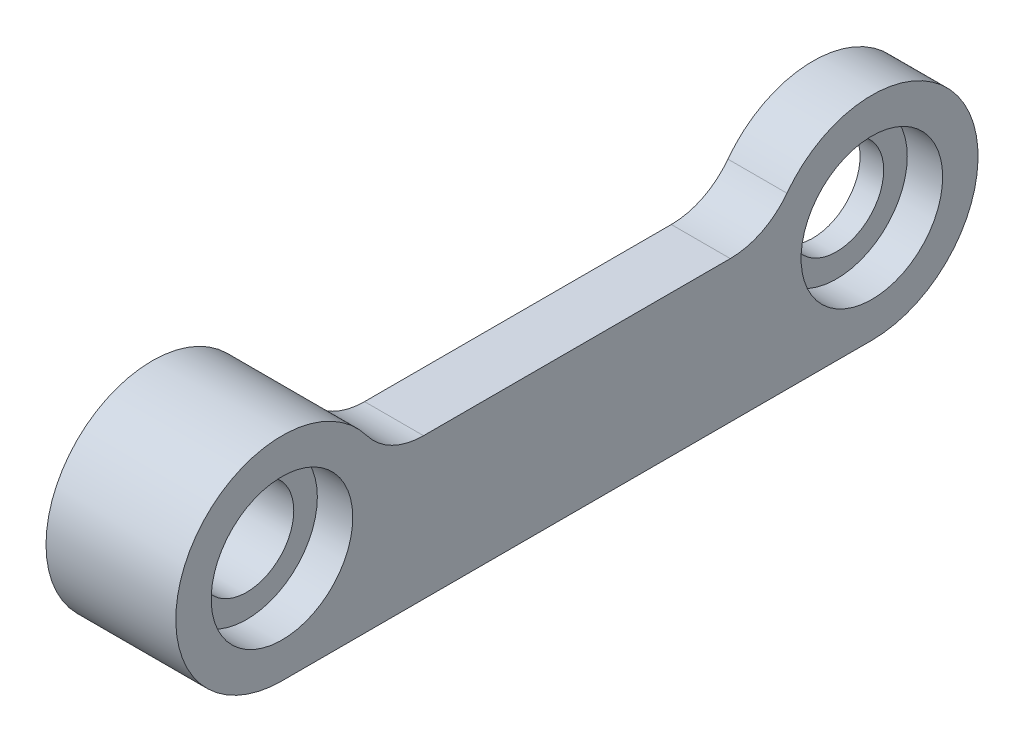
ISO-10303-21;
HEADER;
FILE_DESCRIPTION(('STEP AP214'),'2;1');
FILE_NAME('part.step','',(''),(''),'','','');
FILE_SCHEMA(('AUTOMOTIVE_DESIGN { 1 0 10303 214 1 1 1 1 }'));
ENDSEC;
DATA;
#1=APPLICATION_CONTEXT('core data for automotive mechanical design processes');
#2=APPLICATION_PROTOCOL_DEFINITION('international standard','automotive_design',2000,#1);
#3=PRODUCT_CONTEXT('',#1,'mechanical');
#4=PRODUCT('Part','Part','',(#3));
#5=PRODUCT_RELATED_PRODUCT_CATEGORY('part','',(#4));
#6=PRODUCT_DEFINITION_FORMATION('','',#4);
#7=PRODUCT_DEFINITION_CONTEXT('part definition',#1,'design');
#8=PRODUCT_DEFINITION('design','',#6,#7);
#9=PRODUCT_DEFINITION_SHAPE('','',#8);
#10=(LENGTH_UNIT() NAMED_UNIT(*) SI_UNIT(.MILLI.,.METRE.));
#11=(NAMED_UNIT(*) PLANE_ANGLE_UNIT() SI_UNIT($,.RADIAN.));
#12=(NAMED_UNIT(*) SI_UNIT($,.STERADIAN.) SOLID_ANGLE_UNIT());
#13=UNCERTAINTY_MEASURE_WITH_UNIT(LENGTH_MEASURE(1.E-05),#10,'distance_accuracy_value','');
#14=(GEOMETRIC_REPRESENTATION_CONTEXT(3) GLOBAL_UNCERTAINTY_ASSIGNED_CONTEXT((#13)) GLOBAL_UNIT_ASSIGNED_CONTEXT((#10,
#11,#12)) REPRESENTATION_CONTEXT('',''));
#15=CARTESIAN_POINT('',(0.,0.,0.));
#16=DIRECTION('',(0.,0.,1.));
#17=DIRECTION('',(1.,0.,0.));
#18=AXIS2_PLACEMENT_3D('',#15,#16,#17);
#19=CARTESIAN_POINT('',(2.5,-1.5,0.));
#20=DIRECTION('',(-1.,0.,0.));
#21=DIRECTION('',(0.,0.,1.));
#22=AXIS2_PLACEMENT_3D('',#19,#20,#21);
#23=CYLINDRICAL_SURFACE('',#22,2.);
#24=CARTESIAN_POINT('',(-3.,-1.5,0.));
#25=DIRECTION('',(1.,0.,0.));
#26=DIRECTION('',(0.,0.,-1.));
#27=AXIS2_PLACEMENT_3D('',#24,#25,#26);
#28=CIRCLE('',#27,2.);
#29=CARTESIAN_POINT('',(-3.,-1.5,-2.));
#30=VERTEX_POINT('',#29);
#31=EDGE_CURVE('E161',#30,#30,#28,.T.);
#32=ORIENTED_EDGE('',*,*,#31,.F.);
#33=EDGE_LOOP('',(#32));
#34=FACE_BOUND('',#33,.T.);
#35=CARTESIAN_POINT('',(1.,-1.5,0.));
#36=DIRECTION('',(1.,0.,0.));
#37=DIRECTION('',(0.,0.,-1.));
#38=AXIS2_PLACEMENT_3D('',#35,#36,#37);
#39=CIRCLE('',#38,2.);
#40=CARTESIAN_POINT('',(1.,-1.5,-2.));
#41=VERTEX_POINT('',#40);
#42=EDGE_CURVE('E72',#41,#41,#39,.T.);
#43=ORIENTED_EDGE('',*,*,#42,.T.);
#44=EDGE_LOOP('',(#43));
#45=FACE_BOUND('',#44,.T.);
#46=ADVANCED_FACE('F68',(#34,#45),#23,.F.);
#47=CARTESIAN_POINT('',(2.5,-1.5,-25.));
#48=DIRECTION('',(-1.,0.,0.));
#49=DIRECTION('',(0.,0.,1.));
#50=AXIS2_PLACEMENT_3D('',#47,#48,#49);
#51=CYLINDRICAL_SURFACE('',#50,2.);
#52=CARTESIAN_POINT('',(0.,-1.5,-25.));
#53=DIRECTION('',(1.,0.,0.));
#54=DIRECTION('',(0.,0.,-1.));
#55=AXIS2_PLACEMENT_3D('',#52,#53,#54);
#56=CIRCLE('',#55,2.);
#57=CARTESIAN_POINT('',(0.,-1.5,-27.));
#58=VERTEX_POINT('',#57);
#59=EDGE_CURVE('E158',#58,#58,#56,.F.);
#60=ORIENTED_EDGE('',*,*,#59,.T.);
#61=EDGE_LOOP('',(#60));
#62=FACE_BOUND('',#61,.T.);
#63=CARTESIAN_POINT('',(1.,-1.5,-25.));
#64=DIRECTION('',(1.,0.,0.));
#65=DIRECTION('',(0.,0.,-1.));
#66=AXIS2_PLACEMENT_3D('',#63,#64,#65);
#67=CIRCLE('',#66,2.);
#68=CARTESIAN_POINT('',(1.,-1.5,-27.));
#69=VERTEX_POINT('',#68);
#70=EDGE_CURVE('E173',#69,#69,#67,.T.);
#71=ORIENTED_EDGE('',*,*,#70,.T.);
#72=EDGE_LOOP('',(#71));
#73=FACE_BOUND('',#72,.T.);
#74=ADVANCED_FACE('F212',(#62,#73),#51,.F.);
#75=CARTESIAN_POINT('',(2.5,-1.5,0.));
#76=DIRECTION('',(1.,0.,0.));
#77=DIRECTION('',(0.,0.,-1.));
#78=AXIS2_PLACEMENT_3D('',#75,#76,#77);
#79=PLANE('',#78);
#80=CARTESIAN_POINT('',(2.5,-1.5,0.));
#81=DIRECTION('',(1.,0.,0.));
#82=DIRECTION('',(0.,0.,-1.));
#83=AXIS2_PLACEMENT_3D('',#80,#81,#82);
#84=CIRCLE('',#83,3.);
#85=CARTESIAN_POINT('',(2.5,-1.5,-3.));
#86=VERTEX_POINT('',#85);
#87=EDGE_CURVE('E180',#86,#86,#84,.T.);
#88=ORIENTED_EDGE('',*,*,#87,.F.);
#89=EDGE_LOOP('',(#88));
#90=FACE_BOUND('',#89,.T.);
#91=CARTESIAN_POINT('',(2.5,-1.5,-25.));
#92=DIRECTION('',(1.,0.,0.));
#93=DIRECTION('',(0.,0.,-1.));
#94=AXIS2_PLACEMENT_3D('',#91,#92,#93);
#95=CIRCLE('',#94,3.);
#96=CARTESIAN_POINT('',(2.5,-1.5,-28.));
#97=VERTEX_POINT('',#96);
#98=EDGE_CURVE('E190',#97,#97,#95,.T.);
#99=ORIENTED_EDGE('',*,*,#98,.F.);
#100=EDGE_LOOP('',(#99));
#101=FACE_BOUND('',#100,.T.);
#102=DIRECTION('',(0.,0.,-1.));
#103=VECTOR('',#102,1.);
#104=CARTESIAN_POINT('',(2.5,-6.,0.));
#105=LINE('',#104,#103);
#106=CARTESIAN_POINT('',(2.5,-6.,0.));
#107=VERTEX_POINT('',#106);
#108=CARTESIAN_POINT('',(2.5,-6.,-25.));
#109=VERTEX_POINT('',#108);
#110=EDGE_CURVE('E136',#107,#109,#105,.T.);
#111=ORIENTED_EDGE('',*,*,#110,.T.);
#112=CARTESIAN_POINT('',(2.5,-1.5,-25.));
#113=DIRECTION('',(1.,0.,0.));
#114=DIRECTION('',(0.,0.,-1.));
#115=AXIS2_PLACEMENT_3D('',#112,#113,#114);
#116=CIRCLE('',#115,4.5);
#117=CARTESIAN_POINT('',(2.5,1.2,-21.4));
#118=VERTEX_POINT('',#117);
#119=EDGE_CURVE('E144',#109,#118,#116,.T.);
#120=ORIENTED_EDGE('',*,*,#119,.T.);
#121=CARTESIAN_POINT('',(2.5,3.,-19.));
#122=DIRECTION('',(1.,0.,0.));
#123=DIRECTION('',(0.,0.,-1.));
#124=AXIS2_PLACEMENT_3D('',#121,#122,#123);
#125=CIRCLE('',#124,3.);
#126=CARTESIAN_POINT('',(2.5,0.,-19.));
#127=VERTEX_POINT('',#126);
#128=EDGE_CURVE('E171',#118,#127,#125,.F.);
#129=ORIENTED_EDGE('',*,*,#128,.T.);
#130=DIRECTION('',(0.,0.,-1.));
#131=VECTOR('',#130,1.);
#132=CARTESIAN_POINT('',(2.5,0.,0.));
#133=LINE('',#132,#131);
#134=CARTESIAN_POINT('',(2.5,0.,-6.));
#135=VERTEX_POINT('',#134);
#136=EDGE_CURVE('E151',#135,#127,#133,.T.);
#137=ORIENTED_EDGE('',*,*,#136,.F.);
#138=CARTESIAN_POINT('',(2.5,3.,-6.));
#139=DIRECTION('',(1.,0.,0.));
#140=DIRECTION('',(0.,0.,-1.));
#141=AXIS2_PLACEMENT_3D('',#138,#139,#140);
#142=CIRCLE('',#141,3.);
#143=CARTESIAN_POINT('',(2.5,1.2,-3.6));
#144=VERTEX_POINT('',#143);
#145=EDGE_CURVE('E12',#135,#144,#142,.F.);
#146=ORIENTED_EDGE('',*,*,#145,.T.);
#147=CARTESIAN_POINT('',(2.5,-1.5,0.));
#148=DIRECTION('',(1.,0.,0.));
#149=DIRECTION('',(0.,0.,-1.));
#150=AXIS2_PLACEMENT_3D('',#147,#148,#149);
#151=CIRCLE('',#150,4.5);
#152=EDGE_CURVE('E137',#144,#107,#151,.T.);
#153=ORIENTED_EDGE('',*,*,#152,.T.);
#154=EDGE_LOOP('',(#111,#120,#129,#137,#146,#153));
#155=FACE_BOUND('',#154,.T.);
#156=ADVANCED_FACE('F210',(#90,#101,#155),#79,.T.);
#157=CARTESIAN_POINT('',(2.5,-1.5,0.));
#158=DIRECTION('',(-1.,0.,0.));
#159=DIRECTION('',(0.,0.,1.));
#160=AXIS2_PLACEMENT_3D('',#157,#158,#159);
#161=CYLINDRICAL_SURFACE('',#160,4.5);
#162=ORIENTED_EDGE('',*,*,#152,.F.);
#163=DIRECTION('',(-1.,0.,0.));
#164=VECTOR('',#163,1.);
#165=CARTESIAN_POINT('',(2.5,1.2,-3.6));
#166=LINE('',#165,#164);
#167=CARTESIAN_POINT('',(0.,1.2,-3.6));
#168=VERTEX_POINT('',#167);
#169=EDGE_CURVE('E128',#144,#168,#166,.T.);
#170=ORIENTED_EDGE('',*,*,#169,.T.);
#171=CARTESIAN_POINT('',(0.,-1.5,0.));
#172=DIRECTION('',(1.,0.,0.));
#173=DIRECTION('',(0.,0.,-1.));
#174=AXIS2_PLACEMENT_3D('',#171,#172,#173);
#175=CIRCLE('',#174,4.5);
#176=CARTESIAN_POINT('',(0.,-6.,0.));
#177=VERTEX_POINT('',#176);
#178=EDGE_CURVE('E85',#177,#168,#175,.T.);
#179=ORIENTED_EDGE('',*,*,#178,.F.);
#180=DIRECTION('',(-1.,0.,0.));
#181=VECTOR('',#180,1.);
#182=CARTESIAN_POINT('',(2.5,-6.,0.));
#183=LINE('',#182,#181);
#184=EDGE_CURVE('E125',#107,#177,#183,.T.);
#185=ORIENTED_EDGE('',*,*,#184,.F.);
#186=EDGE_LOOP('',(#162,#170,#179,#185));
#187=FACE_BOUND('',#186,.T.);
#188=CARTESIAN_POINT('',(-3.,-1.5,0.));
#189=DIRECTION('',(1.,0.,0.));
#190=DIRECTION('',(0.,0.,-1.));
#191=AXIS2_PLACEMENT_3D('',#188,#189,#190);
#192=CIRCLE('',#191,4.5);
#193=CARTESIAN_POINT('',(-3.,-1.5,-4.5));
#194=VERTEX_POINT('',#193);
#195=EDGE_CURVE('E157',#194,#194,#192,.T.);
#196=ORIENTED_EDGE('',*,*,#195,.T.);
#197=EDGE_LOOP('',(#196));
#198=FACE_BOUND('',#197,.T.);
#199=ADVANCED_FACE('F123',(#187,#198),#161,.T.);
#200=CARTESIAN_POINT('',(0.,-1.5,0.));
#201=DIRECTION('',(1.,0.,0.));
#202=DIRECTION('',(0.,0.,-1.));
#203=AXIS2_PLACEMENT_3D('',#200,#201,#202);
#204=PLANE('',#203);
#205=ORIENTED_EDGE('',*,*,#59,.F.);
#206=EDGE_LOOP('',(#205));
#207=FACE_BOUND('',#206,.T.);
#208=DIRECTION('',(0.,0.,-1.));
#209=VECTOR('',#208,1.);
#210=CARTESIAN_POINT('',(0.,-6.,0.));
#211=LINE('',#210,#209);
#212=CARTESIAN_POINT('',(0.,-6.,-25.));
#213=VERTEX_POINT('',#212);
#214=EDGE_CURVE('E134',#177,#213,#211,.T.);
#215=ORIENTED_EDGE('',*,*,#214,.F.);
#216=ORIENTED_EDGE('',*,*,#178,.T.);
#217=CARTESIAN_POINT('',(0.,3.,-6.));
#218=DIRECTION('',(1.,0.,0.));
#219=DIRECTION('',(0.,0.,-1.));
#220=AXIS2_PLACEMENT_3D('',#217,#218,#219);
#221=CIRCLE('',#220,3.);
#222=CARTESIAN_POINT('',(0.,0.,-6.));
#223=VERTEX_POINT('',#222);
#224=EDGE_CURVE('E77',#168,#223,#221,.T.);
#225=ORIENTED_EDGE('',*,*,#224,.T.);
#226=DIRECTION('',(0.,0.,-1.));
#227=VECTOR('',#226,1.);
#228=CARTESIAN_POINT('',(0.,0.,0.));
#229=LINE('',#228,#227);
#230=CARTESIAN_POINT('',(0.,0.,-19.));
#231=VERTEX_POINT('',#230);
#232=EDGE_CURVE('E143',#223,#231,#229,.T.);
#233=ORIENTED_EDGE('',*,*,#232,.T.);
#234=CARTESIAN_POINT('',(0.,3.,-19.));
#235=DIRECTION('',(1.,0.,0.));
#236=DIRECTION('',(0.,0.,-1.));
#237=AXIS2_PLACEMENT_3D('',#234,#235,#236);
#238=CIRCLE('',#237,3.);
#239=CARTESIAN_POINT('',(0.,1.2,-21.4));
#240=VERTEX_POINT('',#239);
#241=EDGE_CURVE('E169',#231,#240,#238,.T.);
#242=ORIENTED_EDGE('',*,*,#241,.T.);
#243=CARTESIAN_POINT('',(0.,-1.5,-25.));
#244=DIRECTION('',(1.,0.,0.));
#245=DIRECTION('',(0.,0.,-1.));
#246=AXIS2_PLACEMENT_3D('',#243,#244,#245);
#247=CIRCLE('',#246,4.5);
#248=EDGE_CURVE('E142',#213,#240,#247,.T.);
#249=ORIENTED_EDGE('',*,*,#248,.F.);
#250=EDGE_LOOP('',(#215,#216,#225,#233,#242,#249));
#251=FACE_BOUND('',#250,.T.);
#252=ADVANCED_FACE('F140',(#207,#251),#204,.F.);
#253=CARTESIAN_POINT('',(2.5,-1.5,-25.));
#254=DIRECTION('',(-1.,0.,0.));
#255=DIRECTION('',(0.,0.,1.));
#256=AXIS2_PLACEMENT_3D('',#253,#254,#255);
#257=CYLINDRICAL_SURFACE('',#256,4.5);
#258=ORIENTED_EDGE('',*,*,#248,.T.);
#259=DIRECTION('',(-1.,0.,0.));
#260=VECTOR('',#259,1.);
#261=CARTESIAN_POINT('',(2.5,1.2,-21.4));
#262=LINE('',#261,#260);
#263=EDGE_CURVE('E166',#240,#118,#262,.F.);
#264=ORIENTED_EDGE('',*,*,#263,.T.);
#265=ORIENTED_EDGE('',*,*,#119,.F.);
#266=DIRECTION('',(-1.,0.,0.));
#267=VECTOR('',#266,1.);
#268=CARTESIAN_POINT('',(2.5,-6.,-25.));
#269=LINE('',#268,#267);
#270=EDGE_CURVE('E154',#109,#213,#269,.T.);
#271=ORIENTED_EDGE('',*,*,#270,.T.);
#272=EDGE_LOOP('',(#258,#264,#265,#271));
#273=FACE_BOUND('',#272,.T.);
#274=ADVANCED_FACE('F208',(#273),#257,.T.);
#275=CARTESIAN_POINT('',(2.5,0.,0.));
#276=DIRECTION('',(0.,1.,0.));
#277=DIRECTION('',(0.,0.,1.));
#278=AXIS2_PLACEMENT_3D('',#275,#276,#277);
#279=PLANE('',#278);
#280=ORIENTED_EDGE('',*,*,#136,.T.);
#281=DIRECTION('',(-1.,0.,0.));
#282=VECTOR('',#281,1.);
#283=CARTESIAN_POINT('',(2.5,0.,-19.));
#284=LINE('',#283,#282);
#285=EDGE_CURVE('E163',#127,#231,#284,.T.);
#286=ORIENTED_EDGE('',*,*,#285,.T.);
#287=ORIENTED_EDGE('',*,*,#232,.F.);
#288=DIRECTION('',(-1.,0.,0.));
#289=VECTOR('',#288,1.);
#290=CARTESIAN_POINT('',(2.5,0.,-6.));
#291=LINE('',#290,#289);
#292=EDGE_CURVE('E129',#223,#135,#291,.F.);
#293=ORIENTED_EDGE('',*,*,#292,.T.);
#294=EDGE_LOOP('',(#280,#286,#287,#293));
#295=FACE_BOUND('',#294,.T.);
#296=ADVANCED_FACE('F200',(#295),#279,.T.);
#297=CARTESIAN_POINT('',(2.5,-6.,0.));
#298=DIRECTION('',(0.,1.,0.));
#299=DIRECTION('',(0.,0.,1.));
#300=AXIS2_PLACEMENT_3D('',#297,#298,#299);
#301=PLANE('',#300);
#302=ORIENTED_EDGE('',*,*,#214,.T.);
#303=ORIENTED_EDGE('',*,*,#270,.F.);
#304=ORIENTED_EDGE('',*,*,#110,.F.);
#305=ORIENTED_EDGE('',*,*,#184,.T.);
#306=EDGE_LOOP('',(#302,#303,#304,#305));
#307=FACE_BOUND('',#306,.T.);
#308=ADVANCED_FACE('F133',(#307),#301,.F.);
#309=CARTESIAN_POINT('',(-3.,-1.5,0.));
#310=DIRECTION('',(1.,0.,0.));
#311=DIRECTION('',(0.,0.,-1.));
#312=AXIS2_PLACEMENT_3D('',#309,#310,#311);
#313=PLANE('',#312);
#314=ORIENTED_EDGE('',*,*,#31,.T.);
#315=EDGE_LOOP('',(#314));
#316=FACE_BOUND('',#315,.T.);
#317=ORIENTED_EDGE('',*,*,#195,.F.);
#318=EDGE_LOOP('',(#317));
#319=FACE_BOUND('',#318,.T.);
#320=ADVANCED_FACE('F215',(#316,#319),#313,.F.);
#321=CARTESIAN_POINT('',(2.5,3.,-19.));
#322=DIRECTION('',(-1.,0.,0.));
#323=DIRECTION('',(0.,0.,1.));
#324=AXIS2_PLACEMENT_3D('',#321,#322,#323);
#325=CYLINDRICAL_SURFACE('',#324,3.);
#326=ORIENTED_EDGE('',*,*,#128,.F.);
#327=ORIENTED_EDGE('',*,*,#263,.F.);
#328=ORIENTED_EDGE('',*,*,#241,.F.);
#329=ORIENTED_EDGE('',*,*,#285,.F.);
#330=EDGE_LOOP('',(#326,#327,#328,#329));
#331=FACE_BOUND('',#330,.T.);
#332=ADVANCED_FACE('F205',(#331),#325,.F.);
#333=CARTESIAN_POINT('',(2.5,3.,-6.));
#334=DIRECTION('',(-1.,0.,0.));
#335=DIRECTION('',(0.,0.,1.));
#336=AXIS2_PLACEMENT_3D('',#333,#334,#335);
#337=CYLINDRICAL_SURFACE('',#336,3.);
#338=ORIENTED_EDGE('',*,*,#145,.F.);
#339=ORIENTED_EDGE('',*,*,#292,.F.);
#340=ORIENTED_EDGE('',*,*,#224,.F.);
#341=ORIENTED_EDGE('',*,*,#169,.F.);
#342=EDGE_LOOP('',(#338,#339,#340,#341));
#343=FACE_BOUND('',#342,.T.);
#344=ADVANCED_FACE('F70',(#343),#337,.F.);
#345=CARTESIAN_POINT('',(1.,-1.5,-25.));
#346=DIRECTION('',(1.,0.,0.));
#347=DIRECTION('',(0.,0.,-1.));
#348=AXIS2_PLACEMENT_3D('',#345,#346,#347);
#349=CYLINDRICAL_SURFACE('',#348,3.);
#350=CARTESIAN_POINT('',(1.,-1.5,-25.));
#351=DIRECTION('',(1.,0.,0.));
#352=DIRECTION('',(0.,0.,-1.));
#353=AXIS2_PLACEMENT_3D('',#350,#351,#352);
#354=CIRCLE('',#353,3.);
#355=CARTESIAN_POINT('',(1.,-1.5,-28.));
#356=VERTEX_POINT('',#355);
#357=EDGE_CURVE('E185',#356,#356,#354,.T.);
#358=ORIENTED_EDGE('',*,*,#357,.F.);
#359=EDGE_LOOP('',(#358));
#360=FACE_BOUND('',#359,.T.);
#361=ORIENTED_EDGE('',*,*,#98,.T.);
#362=EDGE_LOOP('',(#361));
#363=FACE_BOUND('',#362,.T.);
#364=ADVANCED_FACE('F239',(#360,#363),#349,.F.);
#365=CARTESIAN_POINT('',(1.,-1.5,-25.));
#366=DIRECTION('',(1.,0.,0.));
#367=DIRECTION('',(0.,0.,-1.));
#368=AXIS2_PLACEMENT_3D('',#365,#366,#367);
#369=PLANE('',#368);
#370=ORIENTED_EDGE('',*,*,#70,.F.);
#371=EDGE_LOOP('',(#370));
#372=FACE_BOUND('',#371,.T.);
#373=ORIENTED_EDGE('',*,*,#357,.T.);
#374=EDGE_LOOP('',(#373));
#375=FACE_BOUND('',#374,.T.);
#376=ADVANCED_FACE('F242',(#372,#375),#369,.T.);
#377=CARTESIAN_POINT('',(1.,-1.5,0.));
#378=DIRECTION('',(1.,0.,0.));
#379=DIRECTION('',(0.,0.,-1.));
#380=AXIS2_PLACEMENT_3D('',#377,#378,#379);
#381=CYLINDRICAL_SURFACE('',#380,3.);
#382=CARTESIAN_POINT('',(1.,-1.5,0.));
#383=DIRECTION('',(1.,0.,0.));
#384=DIRECTION('',(0.,0.,-1.));
#385=AXIS2_PLACEMENT_3D('',#382,#383,#384);
#386=CIRCLE('',#385,3.);
#387=CARTESIAN_POINT('',(1.,-1.5,-3.));
#388=VERTEX_POINT('',#387);
#389=EDGE_CURVE('E175',#388,#388,#386,.T.);
#390=ORIENTED_EDGE('',*,*,#389,.F.);
#391=EDGE_LOOP('',(#390));
#392=FACE_BOUND('',#391,.T.);
#393=ORIENTED_EDGE('',*,*,#87,.T.);
#394=EDGE_LOOP('',(#393));
#395=FACE_BOUND('',#394,.T.);
#396=ADVANCED_FACE('F246',(#392,#395),#381,.F.);
#397=CARTESIAN_POINT('',(1.,-1.5,0.));
#398=DIRECTION('',(1.,0.,0.));
#399=DIRECTION('',(0.,0.,-1.));
#400=AXIS2_PLACEMENT_3D('',#397,#398,#399);
#401=PLANE('',#400);
#402=ORIENTED_EDGE('',*,*,#42,.F.);
#403=EDGE_LOOP('',(#402));
#404=FACE_BOUND('',#403,.T.);
#405=ORIENTED_EDGE('',*,*,#389,.T.);
#406=EDGE_LOOP('',(#405));
#407=FACE_BOUND('',#406,.T.);
#408=ADVANCED_FACE('F250',(#404,#407),#401,.T.);
#409=CLOSED_SHELL('',(#46,#74,#156,#199,#252,#274,#296,#308,#320,#332,#344,#364,#376,#396,#408));
#410=MANIFOLD_SOLID_BREP('B2',#409);
#411=ADVANCED_BREP_SHAPE_REPRESENTATION('',(#18,#410),#14);
#412=SHAPE_DEFINITION_REPRESENTATION(#9,#411);
ENDSEC;
END-ISO-10303-21;
